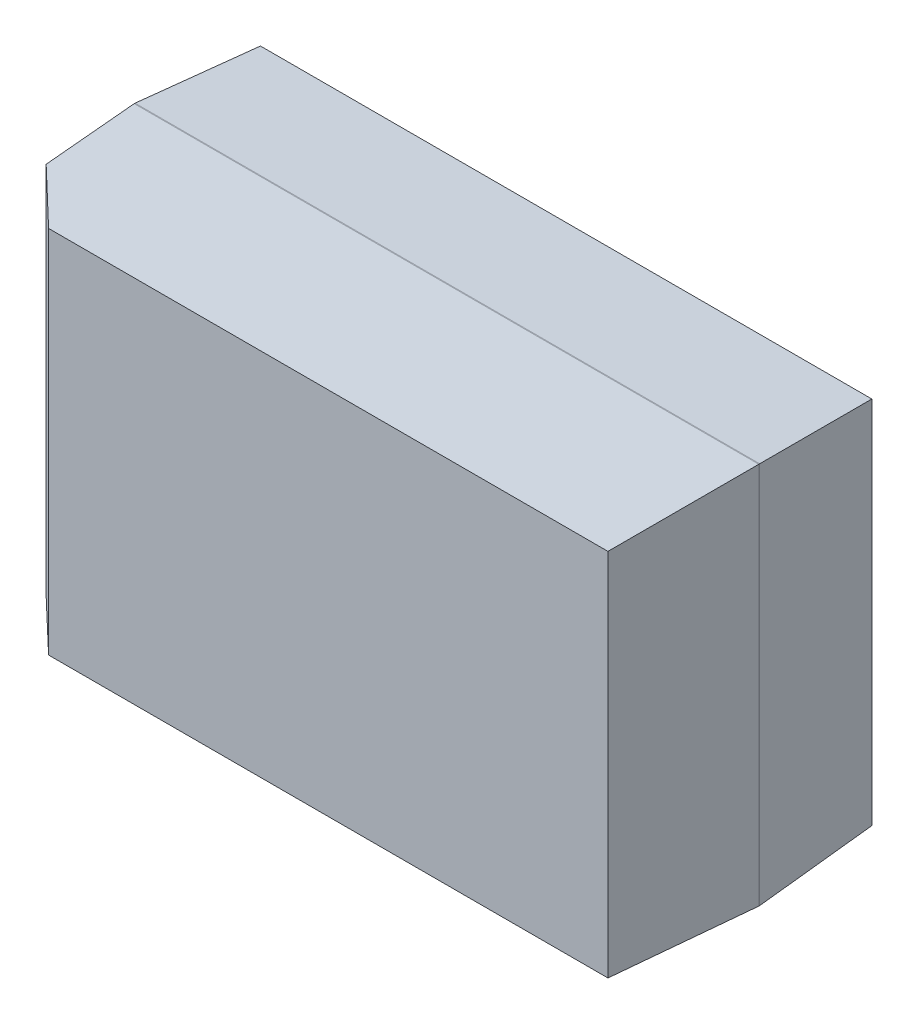
ISO-10303-21;
HEADER;
FILE_DESCRIPTION(('STEP AP214'),'2;1');
FILE_NAME('part.step','',(''),(''),'','','');
FILE_SCHEMA(('AUTOMOTIVE_DESIGN { 1 0 10303 214 1 1 1 1 }'));
ENDSEC;
DATA;
#1=APPLICATION_CONTEXT('core data for automotive mechanical design processes');
#2=APPLICATION_PROTOCOL_DEFINITION('international standard','automotive_design',2000,#1);
#3=PRODUCT_CONTEXT('',#1,'mechanical');
#4=PRODUCT('Part','Part','',(#3));
#5=PRODUCT_RELATED_PRODUCT_CATEGORY('part','',(#4));
#6=PRODUCT_DEFINITION_FORMATION('','',#4);
#7=PRODUCT_DEFINITION_CONTEXT('part definition',#1,'design');
#8=PRODUCT_DEFINITION('design','',#6,#7);
#9=PRODUCT_DEFINITION_SHAPE('','',#8);
#10=(LENGTH_UNIT() NAMED_UNIT(*) SI_UNIT(.MILLI.,.METRE.));
#11=(NAMED_UNIT(*) PLANE_ANGLE_UNIT() SI_UNIT($,.RADIAN.));
#12=(NAMED_UNIT(*) SI_UNIT($,.STERADIAN.) SOLID_ANGLE_UNIT());
#13=UNCERTAINTY_MEASURE_WITH_UNIT(LENGTH_MEASURE(1.E-05),#10,'distance_accuracy_value','');
#14=(GEOMETRIC_REPRESENTATION_CONTEXT(3) GLOBAL_UNCERTAINTY_ASSIGNED_CONTEXT((#13)) GLOBAL_UNIT_ASSIGNED_CONTEXT((#10,
#11,#12)) REPRESENTATION_CONTEXT('',''));
#15=CARTESIAN_POINT('',(0.,0.,0.));
#16=DIRECTION('',(0.,0.,1.));
#17=DIRECTION('',(1.,0.,0.));
#18=AXIS2_PLACEMENT_3D('',#15,#16,#17);
#19=CARTESIAN_POINT('',(-3.19268150507,-2.1,2.804475533578));
#20=DIRECTION('',(0.690766255400393,0.,-0.723078128835411));
#21=DIRECTION('',(-0.723078128835411,0.,-0.690766255400393));
#22=AXIS2_PLACEMENT_3D('',#19,#20,#21);
#23=PLANE('',#22);
#24=DIRECTION('',(0.722717610470958,-0.0315741698489411,0.690421847361088));
#25=VECTOR('',#24,1.);
#26=CARTESIAN_POINT('',(-3.50202967680685,2.127029676807,2.50895106715584));
#27=LINE('',#26,#25);
#28=CARTESIAN_POINT('',(-3.50202967680689,2.12702967680697,2.50895106715592));
#29=VERTEX_POINT('',#28);
#30=CARTESIAN_POINT('',(-2.88333333333308,2.1,3.10000000000008));
#31=VERTEX_POINT('',#30);
#32=EDGE_CURVE('E94',#29,#31,#27,.T.);
#33=ORIENTED_EDGE('',*,*,#32,.F.);
#34=DIRECTION('',(0.,1.,0.));
#35=VECTOR('',#34,1.);
#36=CARTESIAN_POINT('',(-3.50202967680689,-2.175,2.50895106715599));
#37=LINE('',#36,#35);
#38=CARTESIAN_POINT('',(-3.50202967680689,-2.12702967680697,2.50895106715592));
#39=VERTEX_POINT('',#38);
#40=EDGE_CURVE('E92',#29,#39,#37,.F.);
#41=ORIENTED_EDGE('',*,*,#40,.T.);
#42=DIRECTION('',(-0.722717610470958,-0.0315741698489411,-0.690421847361088));
#43=VECTOR('',#42,1.);
#44=CARTESIAN_POINT('',(-2.88333333333315,-2.1,3.10000000000016));
#45=LINE('',#44,#43);
#46=CARTESIAN_POINT('',(-2.88333333333308,-2.1,3.10000000000008));
#47=VERTEX_POINT('',#46);
#48=EDGE_CURVE('E20',#47,#39,#45,.T.);
#49=ORIENTED_EDGE('',*,*,#48,.F.);
#50=DIRECTION('',(0.,1.,0.));
#51=VECTOR('',#50,1.);
#52=CARTESIAN_POINT('',(-2.883333333333,-2.175,3.1));
#53=LINE('',#52,#51);
#54=EDGE_CURVE('E89',#31,#47,#53,.F.);
#55=ORIENTED_EDGE('',*,*,#54,.F.);
#56=EDGE_LOOP('',(#33,#41,#49,#55));
#57=FACE_BOUND('',#56,.T.);
#58=ADVANCED_FACE('F17',(#57),#23,.F.);
#59=CARTESIAN_POINT('',(-3.55,-2.175,3.1));
#60=DIRECTION('',(0.,0.,1.));
#61=DIRECTION('',(1.,0.,0.));
#62=AXIS2_PLACEMENT_3D('',#59,#60,#61);
#63=PLANE('',#62);
#64=DIRECTION('',(1.,0.,0.));
#65=VECTOR('',#64,1.);
#66=CARTESIAN_POINT('',(-3.55,2.09999999999998,3.1));
#67=LINE('',#66,#65);
#68=CARTESIAN_POINT('',(3.475,2.1,3.1));
#69=VERTEX_POINT('',#68);
#70=EDGE_CURVE('E100',#31,#69,#67,.T.);
#71=ORIENTED_EDGE('',*,*,#70,.F.);
#72=ORIENTED_EDGE('',*,*,#54,.T.);
#73=DIRECTION('',(1.,0.,0.));
#74=VECTOR('',#73,1.);
#75=CARTESIAN_POINT('',(-3.55,-2.09999999999998,3.1));
#76=LINE('',#75,#74);
#77=CARTESIAN_POINT('',(3.475,-2.09999999999999,3.1));
#78=VERTEX_POINT('',#77);
#79=EDGE_CURVE('E98',#47,#78,#76,.T.);
#80=ORIENTED_EDGE('',*,*,#79,.T.);
#81=DIRECTION('',(0.,1.,0.));
#82=VECTOR('',#81,1.);
#83=CARTESIAN_POINT('',(3.47499999999998,-2.175,3.1));
#84=LINE('',#83,#82);
#85=EDGE_CURVE('E155',#69,#78,#84,.F.);
#86=ORIENTED_EDGE('',*,*,#85,.F.);
#87=EDGE_LOOP('',(#71,#72,#80,#86));
#88=FACE_BOUND('',#87,.T.);
#89=ADVANCED_FACE('F96',(#88),#63,.T.);
#90=CARTESIAN_POINT('',(-3.5125,-2.175,2.28));
#91=DIRECTION('',(0.998955942835112,0.,-0.0456839608004051));
#92=DIRECTION('',(-0.0456839608004051,0.,-0.998955942835112));
#93=AXIS2_PLACEMENT_3D('',#90,#91,#92);
#94=PLANE('',#93);
#95=DIRECTION('',(0.0456363635222733,-0.0456363635223966,0.997915149022658));
#96=VECTOR('',#95,1.);
#97=CARTESIAN_POINT('',(-3.55,2.17500000000002,1.46));
#98=LINE('',#97,#96);
#99=CARTESIAN_POINT('',(-3.55000000000001,2.175,1.46));
#100=VERTEX_POINT('',#99);
#101=EDGE_CURVE('E116',#100,#29,#98,.T.);
#102=ORIENTED_EDGE('',*,*,#101,.F.);
#103=DIRECTION('',(0.,1.,0.));
#104=VECTOR('',#103,1.);
#105=CARTESIAN_POINT('',(-3.55,-2.175,1.46));
#106=LINE('',#105,#104);
#107=CARTESIAN_POINT('',(-3.55000000000001,-2.175,1.46));
#108=VERTEX_POINT('',#107);
#109=EDGE_CURVE('E120',#100,#108,#106,.F.);
#110=ORIENTED_EDGE('',*,*,#109,.T.);
#111=DIRECTION('',(0.0456363635222733,0.0456363635223966,0.997915149022658));
#112=VECTOR('',#111,1.);
#113=CARTESIAN_POINT('',(-3.55,-2.17500000000002,1.46));
#114=LINE('',#113,#112);
#115=EDGE_CURVE('E106',#108,#39,#114,.T.);
#116=ORIENTED_EDGE('',*,*,#115,.T.);
#117=ORIENTED_EDGE('',*,*,#40,.F.);
#118=EDGE_LOOP('',(#102,#110,#116,#117));
#119=FACE_BOUND('',#118,.T.);
#120=ADVANCED_FACE('F118',(#119),#94,.F.);
#121=CARTESIAN_POINT('',(-3.55,-2.1375,2.28));
#122=DIRECTION('',(0.,0.998955942835112,-0.0456839608004051));
#123=DIRECTION('',(0.,0.0456839608004051,0.998955942835112));
#124=AXIS2_PLACEMENT_3D('',#121,#122,#123);
#125=PLANE('',#124);
#126=DIRECTION('',(1.,0.,0.));
#127=VECTOR('',#126,1.);
#128=CARTESIAN_POINT('',(-3.55,-2.175,1.46));
#129=LINE('',#128,#127);
#130=CARTESIAN_POINT('',(3.55,-2.17500000000001,1.46));
#131=VERTEX_POINT('',#130);
#132=EDGE_CURVE('E122',#108,#131,#129,.T.);
#133=ORIENTED_EDGE('',*,*,#132,.T.);
#134=DIRECTION('',(0.0456363635223962,-0.0456363635223772,-0.997915149022654));
#135=VECTOR('',#134,1.);
#136=CARTESIAN_POINT('',(3.47499999999998,-2.1,3.1));
#137=LINE('',#136,#135);
#138=EDGE_CURVE('E105',#78,#131,#137,.T.);
#139=ORIENTED_EDGE('',*,*,#138,.F.);
#140=ORIENTED_EDGE('',*,*,#79,.F.);
#141=ORIENTED_EDGE('',*,*,#48,.T.);
#142=ORIENTED_EDGE('',*,*,#115,.F.);
#143=EDGE_LOOP('',(#133,#139,#140,#141,#142));
#144=FACE_BOUND('',#143,.T.);
#145=ADVANCED_FACE('F104',(#144),#125,.F.);
#146=CARTESIAN_POINT('',(3.5125,-2.175,2.28));
#147=DIRECTION('',(0.998955942835112,0.,0.0456839608004051));
#148=DIRECTION('',(0.0456839608004051,0.,-0.998955942835112));
#149=AXIS2_PLACEMENT_3D('',#146,#147,#148);
#150=PLANE('',#149);
#151=DIRECTION('',(0.0456363635223772,0.0456363635223962,-0.997915149022654));
#152=VECTOR('',#151,1.);
#153=CARTESIAN_POINT('',(3.475,2.09999999999998,3.1));
#154=LINE('',#153,#152);
#155=CARTESIAN_POINT('',(3.55000000000001,2.175,1.46));
#156=VERTEX_POINT('',#155);
#157=EDGE_CURVE('E152',#69,#156,#154,.T.);
#158=ORIENTED_EDGE('',*,*,#157,.F.);
#159=ORIENTED_EDGE('',*,*,#85,.T.);
#160=ORIENTED_EDGE('',*,*,#138,.T.);
#161=DIRECTION('',(0.,1.,0.));
#162=VECTOR('',#161,1.);
#163=CARTESIAN_POINT('',(3.55,-2.175,1.46));
#164=LINE('',#163,#162);
#165=EDGE_CURVE('E133',#156,#131,#164,.F.);
#166=ORIENTED_EDGE('',*,*,#165,.F.);
#167=EDGE_LOOP('',(#158,#159,#160,#166));
#168=FACE_BOUND('',#167,.T.);
#169=ADVANCED_FACE('F156',(#168),#150,.T.);
#170=CARTESIAN_POINT('',(-3.55,2.1375,2.28));
#171=DIRECTION('',(0.,0.998955942835112,0.0456839608004051));
#172=DIRECTION('',(0.,-0.0456839608004051,0.998955942835112));
#173=AXIS2_PLACEMENT_3D('',#170,#171,#172);
#174=PLANE('',#173);
#175=DIRECTION('',(1.,0.,0.));
#176=VECTOR('',#175,1.);
#177=CARTESIAN_POINT('',(-3.55,2.175,1.46));
#178=LINE('',#177,#176);
#179=EDGE_CURVE('E157',#100,#156,#178,.T.);
#180=ORIENTED_EDGE('',*,*,#179,.F.);
#181=ORIENTED_EDGE('',*,*,#101,.T.);
#182=ORIENTED_EDGE('',*,*,#32,.T.);
#183=ORIENTED_EDGE('',*,*,#70,.T.);
#184=ORIENTED_EDGE('',*,*,#157,.T.);
#185=EDGE_LOOP('',(#180,#181,#182,#183,#184));
#186=FACE_BOUND('',#185,.T.);
#187=ADVANCED_FACE('F114',(#186),#174,.T.);
#188=CARTESIAN_POINT('',(-3.55,-2.175,0.1));
#189=DIRECTION('',(1.,0.,0.));
#190=DIRECTION('',(0.,0.,-1.));
#191=AXIS2_PLACEMENT_3D('',#188,#189,#190);
#192=PLANE('',#191);
#193=DIRECTION('',(0.,0.,1.));
#194=VECTOR('',#193,1.);
#195=CARTESIAN_POINT('',(-3.55,2.175,0.1));
#196=LINE('',#195,#194);
#197=CARTESIAN_POINT('',(-3.55,2.175,1.45));
#198=VERTEX_POINT('',#197);
#199=EDGE_CURVE('E161',#198,#100,#196,.T.);
#200=ORIENTED_EDGE('',*,*,#199,.F.);
#201=DIRECTION('',(0.,1.,0.));
#202=VECTOR('',#201,1.);
#203=CARTESIAN_POINT('',(-3.55000000000003,-2.175,1.45));
#204=LINE('',#203,#202);
#205=CARTESIAN_POINT('',(-3.55,-2.175,1.45));
#206=VERTEX_POINT('',#205);
#207=EDGE_CURVE('E160',#206,#198,#204,.T.);
#208=ORIENTED_EDGE('',*,*,#207,.F.);
#209=DIRECTION('',(0.,0.,1.));
#210=VECTOR('',#209,1.);
#211=CARTESIAN_POINT('',(-3.55,-2.175,0.1));
#212=LINE('',#211,#210);
#213=EDGE_CURVE('E128',#206,#108,#212,.T.);
#214=ORIENTED_EDGE('',*,*,#213,.T.);
#215=ORIENTED_EDGE('',*,*,#109,.F.);
#216=EDGE_LOOP('',(#200,#208,#214,#215));
#217=FACE_BOUND('',#216,.T.);
#218=ADVANCED_FACE('F195',(#217),#192,.F.);
#219=CARTESIAN_POINT('',(-3.55,-2.175,0.1));
#220=DIRECTION('',(0.,1.,0.));
#221=DIRECTION('',(0.,0.,1.));
#222=AXIS2_PLACEMENT_3D('',#219,#220,#221);
#223=PLANE('',#222);
#224=ORIENTED_EDGE('',*,*,#213,.F.);
#225=DIRECTION('',(1.,0.,0.));
#226=VECTOR('',#225,1.);
#227=CARTESIAN_POINT('',(-3.55,-2.17500000000003,1.45));
#228=LINE('',#227,#226);
#229=CARTESIAN_POINT('',(3.55,-2.17500000000001,1.45));
#230=VERTEX_POINT('',#229);
#231=EDGE_CURVE('E144',#230,#206,#228,.F.);
#232=ORIENTED_EDGE('',*,*,#231,.F.);
#233=DIRECTION('',(0.,0.,-1.));
#234=VECTOR('',#233,1.);
#235=CARTESIAN_POINT('',(3.55,-2.175,0.1));
#236=LINE('',#235,#234);
#237=EDGE_CURVE('E127',#131,#230,#236,.T.);
#238=ORIENTED_EDGE('',*,*,#237,.F.);
#239=ORIENTED_EDGE('',*,*,#132,.F.);
#240=EDGE_LOOP('',(#224,#232,#238,#239));
#241=FACE_BOUND('',#240,.T.);
#242=ADVANCED_FACE('F142',(#241),#223,.F.);
#243=CARTESIAN_POINT('',(3.55,-2.175,0.1));
#244=DIRECTION('',(1.,0.,0.));
#245=DIRECTION('',(0.,0.,-1.));
#246=AXIS2_PLACEMENT_3D('',#243,#244,#245);
#247=PLANE('',#246);
#248=DIRECTION('',(0.,0.,1.));
#249=VECTOR('',#248,1.);
#250=CARTESIAN_POINT('',(3.55,2.175,0.1));
#251=LINE('',#250,#249);
#252=CARTESIAN_POINT('',(3.55000000000001,2.175,1.45));
#253=VERTEX_POINT('',#252);
#254=EDGE_CURVE('E137',#156,#253,#251,.F.);
#255=ORIENTED_EDGE('',*,*,#254,.F.);
#256=ORIENTED_EDGE('',*,*,#165,.T.);
#257=ORIENTED_EDGE('',*,*,#237,.T.);
#258=DIRECTION('',(0.,1.,0.));
#259=VECTOR('',#258,1.);
#260=CARTESIAN_POINT('',(3.55000000000003,-2.175,1.45));
#261=LINE('',#260,#259);
#262=EDGE_CURVE('E169',#230,#253,#261,.T.);
#263=ORIENTED_EDGE('',*,*,#262,.T.);
#264=EDGE_LOOP('',(#255,#256,#257,#263));
#265=FACE_BOUND('',#264,.T.);
#266=ADVANCED_FACE('F134',(#265),#247,.T.);
#267=CARTESIAN_POINT('',(-3.55,2.175,0.1));
#268=DIRECTION('',(0.,1.,0.));
#269=DIRECTION('',(0.,0.,1.));
#270=AXIS2_PLACEMENT_3D('',#267,#268,#269);
#271=PLANE('',#270);
#272=ORIENTED_EDGE('',*,*,#199,.T.);
#273=ORIENTED_EDGE('',*,*,#179,.T.);
#274=ORIENTED_EDGE('',*,*,#254,.T.);
#275=DIRECTION('',(1.,0.,0.));
#276=VECTOR('',#275,1.);
#277=CARTESIAN_POINT('',(-3.55,2.17500000000003,1.45));
#278=LINE('',#277,#276);
#279=EDGE_CURVE('E168',#253,#198,#278,.F.);
#280=ORIENTED_EDGE('',*,*,#279,.T.);
#281=EDGE_LOOP('',(#272,#273,#274,#280));
#282=FACE_BOUND('',#281,.T.);
#283=ADVANCED_FACE('F167',(#282),#271,.T.);
#284=CARTESIAN_POINT('',(-3.5125,-2.175,0.775));
#285=DIRECTION('',(-0.99846035320541,0.,-0.0554700196225628));
#286=DIRECTION('',(-0.0554700196225628,0.,0.99846035320541));
#287=AXIS2_PLACEMENT_3D('',#284,#285,#286);
#288=PLANE('',#287);
#289=DIRECTION('',(0.0553848775621708,-0.0553848775622111,-0.996927796119078));
#290=VECTOR('',#289,1.);
#291=CARTESIAN_POINT('',(-3.55,2.17500000000003,1.45));
#292=LINE('',#291,#290);
#293=CARTESIAN_POINT('',(-3.47499999999999,2.09999999999999,0.100000000000001));
#294=VERTEX_POINT('',#293);
#295=EDGE_CURVE('E177',#198,#294,#292,.T.);
#296=ORIENTED_EDGE('',*,*,#295,.T.);
#297=DIRECTION('',(0.,1.,0.));
#298=VECTOR('',#297,1.);
#299=CARTESIAN_POINT('',(-3.475,-2.175,0.1));
#300=LINE('',#299,#298);
#301=CARTESIAN_POINT('',(-3.47499999999999,-2.09999999999999,0.100000000000001));
#302=VERTEX_POINT('',#301);
#303=EDGE_CURVE('E199',#294,#302,#300,.F.);
#304=ORIENTED_EDGE('',*,*,#303,.T.);
#305=DIRECTION('',(0.0553848775621708,0.0553848775622111,-0.996927796119078));
#306=VECTOR('',#305,1.);
#307=CARTESIAN_POINT('',(-3.55,-2.17500000000003,1.45));
#308=LINE('',#307,#306);
#309=EDGE_CURVE('E186',#206,#302,#308,.T.);
#310=ORIENTED_EDGE('',*,*,#309,.F.);
#311=ORIENTED_EDGE('',*,*,#207,.T.);
#312=EDGE_LOOP('',(#296,#304,#310,#311));
#313=FACE_BOUND('',#312,.T.);
#314=ADVANCED_FACE('F198',(#313),#288,.T.);
#315=CARTESIAN_POINT('',(-3.55,-2.1375,0.775));
#316=DIRECTION('',(0.,-0.99846035320541,-0.0554700196225628));
#317=DIRECTION('',(0.,0.0554700196225628,-0.99846035320541));
#318=AXIS2_PLACEMENT_3D('',#315,#316,#317);
#319=PLANE('',#318);
#320=ORIENTED_EDGE('',*,*,#231,.T.);
#321=ORIENTED_EDGE('',*,*,#309,.T.);
#322=DIRECTION('',(1.,0.,0.));
#323=VECTOR('',#322,1.);
#324=CARTESIAN_POINT('',(-3.55,-2.1,0.1));
#325=LINE('',#324,#323);
#326=CARTESIAN_POINT('',(3.47499999999999,-2.09999999999999,0.100000000000001));
#327=VERTEX_POINT('',#326);
#328=EDGE_CURVE('E201',#302,#327,#325,.T.);
#329=ORIENTED_EDGE('',*,*,#328,.T.);
#330=DIRECTION('',(0.0553848775622111,-0.0553848775621708,0.996927796119078));
#331=VECTOR('',#330,1.);
#332=CARTESIAN_POINT('',(3.47499999999997,-2.1,0.100000000000001));
#333=LINE('',#332,#331);
#334=EDGE_CURVE('E172',#327,#230,#333,.T.);
#335=ORIENTED_EDGE('',*,*,#334,.T.);
#336=EDGE_LOOP('',(#320,#321,#329,#335));
#337=FACE_BOUND('',#336,.T.);
#338=ADVANCED_FACE('F189',(#337),#319,.T.);
#339=CARTESIAN_POINT('',(3.5125,-2.175,0.775));
#340=DIRECTION('',(-0.99846035320541,0.,0.0554700196225628));
#341=DIRECTION('',(0.0554700196225628,0.,0.99846035320541));
#342=AXIS2_PLACEMENT_3D('',#339,#340,#341);
#343=PLANE('',#342);
#344=DIRECTION('',(0.0553848775621708,0.0553848775622111,0.996927796119078));
#345=VECTOR('',#344,1.);
#346=CARTESIAN_POINT('',(3.475,2.09999999999997,0.100000000000001));
#347=LINE('',#346,#345);
#348=CARTESIAN_POINT('',(3.47499999999999,2.09999999999999,0.100000000000001));
#349=VERTEX_POINT('',#348);
#350=EDGE_CURVE('E34',#349,#253,#347,.T.);
#351=ORIENTED_EDGE('',*,*,#350,.T.);
#352=ORIENTED_EDGE('',*,*,#262,.F.);
#353=ORIENTED_EDGE('',*,*,#334,.F.);
#354=DIRECTION('',(0.,1.,0.));
#355=VECTOR('',#354,1.);
#356=CARTESIAN_POINT('',(3.475,-2.175,0.1));
#357=LINE('',#356,#355);
#358=EDGE_CURVE('E26',#327,#349,#357,.T.);
#359=ORIENTED_EDGE('',*,*,#358,.T.);
#360=EDGE_LOOP('',(#351,#352,#353,#359));
#361=FACE_BOUND('',#360,.T.);
#362=ADVANCED_FACE('F180',(#361),#343,.F.);
#363=CARTESIAN_POINT('',(-3.55,2.1375,0.775));
#364=DIRECTION('',(0.,-0.99846035320541,0.0554700196225628));
#365=DIRECTION('',(0.,-0.0554700196225628,-0.99846035320541));
#366=AXIS2_PLACEMENT_3D('',#363,#364,#365);
#367=PLANE('',#366);
#368=ORIENTED_EDGE('',*,*,#279,.F.);
#369=ORIENTED_EDGE('',*,*,#350,.F.);
#370=DIRECTION('',(1.,0.,0.));
#371=VECTOR('',#370,1.);
#372=CARTESIAN_POINT('',(-3.55,2.1,0.1));
#373=LINE('',#372,#371);
#374=EDGE_CURVE('E11',#349,#294,#373,.F.);
#375=ORIENTED_EDGE('',*,*,#374,.T.);
#376=ORIENTED_EDGE('',*,*,#295,.F.);
#377=EDGE_LOOP('',(#368,#369,#375,#376));
#378=FACE_BOUND('',#377,.T.);
#379=ADVANCED_FACE('F175',(#378),#367,.F.);
#380=CARTESIAN_POINT('',(-3.55,-2.175,0.1));
#381=DIRECTION('',(0.,0.,1.));
#382=DIRECTION('',(1.,0.,0.));
#383=AXIS2_PLACEMENT_3D('',#380,#381,#382);
#384=PLANE('',#383);
#385=ORIENTED_EDGE('',*,*,#358,.F.);
#386=ORIENTED_EDGE('',*,*,#328,.F.);
#387=ORIENTED_EDGE('',*,*,#303,.F.);
#388=ORIENTED_EDGE('',*,*,#374,.F.);
#389=EDGE_LOOP('',(#385,#386,#387,#388));
#390=FACE_BOUND('',#389,.T.);
#391=ADVANCED_FACE('F205',(#390),#384,.F.);
#392=CLOSED_SHELL('',(#58,#89,#120,#145,#169,#187,#218,#242,#266,#283,#314,#338,#362,#379,#391));
#393=MANIFOLD_SOLID_BREP('B1',#392);
#394=ADVANCED_BREP_SHAPE_REPRESENTATION('',(#18,#393),#14);
#395=SHAPE_DEFINITION_REPRESENTATION(#9,#394);
ENDSEC;
END-ISO-10303-21;
